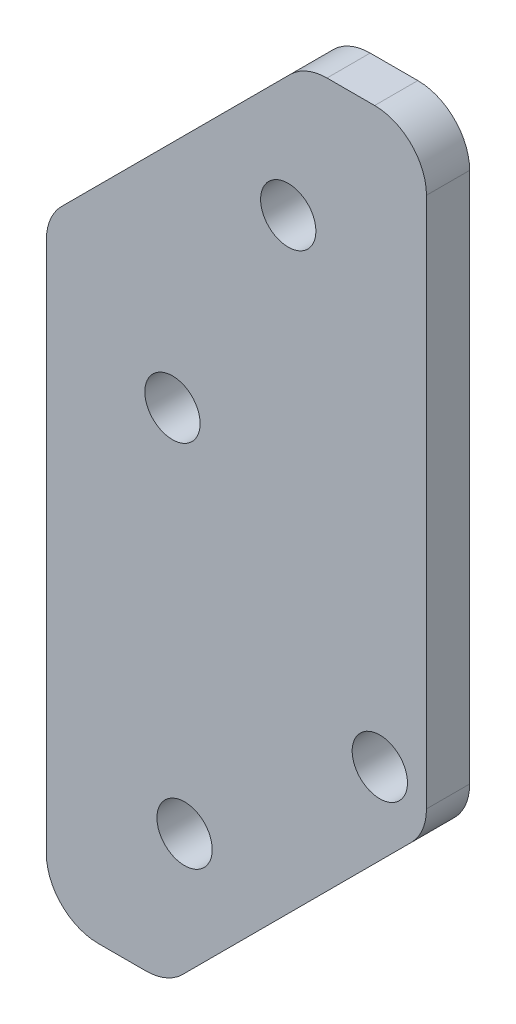
ISO-10303-21;
HEADER;
FILE_DESCRIPTION(('STEP AP214'),'2;1');
FILE_NAME('part.step','',(''),(''),'','','');
FILE_SCHEMA(('AUTOMOTIVE_DESIGN { 1 0 10303 214 1 1 1 1 }'));
ENDSEC;
DATA;
#1=APPLICATION_CONTEXT('core data for automotive mechanical design processes');
#2=APPLICATION_PROTOCOL_DEFINITION('international standard','automotive_design',2000,#1);
#3=PRODUCT_CONTEXT('',#1,'mechanical');
#4=PRODUCT('Part','Part','',(#3));
#5=PRODUCT_RELATED_PRODUCT_CATEGORY('part','',(#4));
#6=PRODUCT_DEFINITION_FORMATION('','',#4);
#7=PRODUCT_DEFINITION_CONTEXT('part definition',#1,'design');
#8=PRODUCT_DEFINITION('design','',#6,#7);
#9=PRODUCT_DEFINITION_SHAPE('','',#8);
#10=(LENGTH_UNIT() NAMED_UNIT(*) SI_UNIT(.MILLI.,.METRE.));
#11=(NAMED_UNIT(*) PLANE_ANGLE_UNIT() SI_UNIT($,.RADIAN.));
#12=(NAMED_UNIT(*) SI_UNIT($,.STERADIAN.) SOLID_ANGLE_UNIT());
#13=UNCERTAINTY_MEASURE_WITH_UNIT(LENGTH_MEASURE(1.E-05),#10,'distance_accuracy_value','');
#14=(GEOMETRIC_REPRESENTATION_CONTEXT(3) GLOBAL_UNCERTAINTY_ASSIGNED_CONTEXT((#13)) GLOBAL_UNIT_ASSIGNED_CONTEXT((#10,
#11,#12)) REPRESENTATION_CONTEXT('',''));
#15=CARTESIAN_POINT('',(0.,0.,0.));
#16=DIRECTION('',(0.,0.,1.));
#17=DIRECTION('',(1.,0.,0.));
#18=AXIS2_PLACEMENT_3D('',#15,#16,#17);
#19=CARTESIAN_POINT('',(0.,0.,2.5));
#20=DIRECTION('',(0.,0.,-1.));
#21=DIRECTION('',(-1.,0.,0.));
#22=AXIS2_PLACEMENT_3D('',#19,#20,#21);
#23=PLANE('',#22);
#24=DIRECTION('',(0.,1.,0.));
#25=VECTOR('',#24,1.);
#26=CARTESIAN_POINT('',(11.,25.,2.5));
#27=LINE('',#26,#25);
#28=CARTESIAN_POINT('',(11.,-8.75735931288073,2.5));
#29=VERTEX_POINT('',#28);
#30=CARTESIAN_POINT('',(11.,22.,2.5));
#31=VERTEX_POINT('',#30);
#32=EDGE_CURVE('E166',#29,#31,#27,.T.);
#33=ORIENTED_EDGE('',*,*,#32,.T.);
#34=CARTESIAN_POINT('',(8.,22.,2.5));
#35=DIRECTION('',(0.,0.,-1.));
#36=DIRECTION('',(-1.,0.,0.));
#37=AXIS2_PLACEMENT_3D('',#34,#35,#36);
#38=CIRCLE('',#37,3.);
#39=CARTESIAN_POINT('',(8.,25.,2.5));
#40=VERTEX_POINT('',#39);
#41=EDGE_CURVE('E203',#31,#40,#38,.F.);
#42=ORIENTED_EDGE('',*,*,#41,.T.);
#43=DIRECTION('',(-1.,0.,0.));
#44=VECTOR('',#43,1.);
#45=CARTESIAN_POINT('',(-11.,25.,2.5));
#46=LINE('',#45,#44);
#47=CARTESIAN_POINT('',(5.24264068711932,25.,2.5));
#48=VERTEX_POINT('',#47);
#49=EDGE_CURVE('E147',#40,#48,#46,.T.);
#50=ORIENTED_EDGE('',*,*,#49,.T.);
#51=CARTESIAN_POINT('',(5.24264068711932,22.,2.5));
#52=DIRECTION('',(0.,0.,-1.));
#53=DIRECTION('',(-1.,0.,0.));
#54=AXIS2_PLACEMENT_3D('',#51,#52,#53);
#55=CIRCLE('',#54,3.);
#56=CARTESIAN_POINT('',(3.12132034355968,24.1213203435596,2.5));
#57=VERTEX_POINT('',#56);
#58=EDGE_CURVE('E196',#48,#57,#55,.F.);
#59=ORIENTED_EDGE('',*,*,#58,.T.);
#60=DIRECTION('',(0.707106781186549,0.707106781186546,0.));
#61=VECTOR('',#60,1.);
#62=CARTESIAN_POINT('',(-11.,10.,2.5));
#63=LINE('',#62,#61);
#64=CARTESIAN_POINT('',(-10.1213203435596,10.8786796564404,2.5));
#65=VERTEX_POINT('',#64);
#66=EDGE_CURVE('E180',#57,#65,#63,.F.);
#67=ORIENTED_EDGE('',*,*,#66,.T.);
#68=CARTESIAN_POINT('',(-8.,8.75735931288072,2.5));
#69=DIRECTION('',(0.,0.,-1.));
#70=DIRECTION('',(-1.,0.,0.));
#71=AXIS2_PLACEMENT_3D('',#68,#69,#70);
#72=CIRCLE('',#71,3.);
#73=CARTESIAN_POINT('',(-11.,8.75735931288072,2.5));
#74=VERTEX_POINT('',#73);
#75=EDGE_CURVE('E198',#65,#74,#72,.F.);
#76=ORIENTED_EDGE('',*,*,#75,.T.);
#77=DIRECTION('',(0.,-1.,0.));
#78=VECTOR('',#77,1.);
#79=CARTESIAN_POINT('',(-11.,25.,2.5));
#80=LINE('',#79,#78);
#81=CARTESIAN_POINT('',(-11.,-22.,2.5));
#82=VERTEX_POINT('',#81);
#83=EDGE_CURVE('E229',#74,#82,#80,.T.);
#84=ORIENTED_EDGE('',*,*,#83,.T.);
#85=CARTESIAN_POINT('',(-8.,-22.,2.5));
#86=DIRECTION('',(0.,0.,-1.));
#87=DIRECTION('',(-1.,0.,0.));
#88=AXIS2_PLACEMENT_3D('',#85,#86,#87);
#89=CIRCLE('',#88,3.);
#90=CARTESIAN_POINT('',(-8.,-25.,2.5));
#91=VERTEX_POINT('',#90);
#92=EDGE_CURVE('E194',#82,#91,#89,.F.);
#93=ORIENTED_EDGE('',*,*,#92,.T.);
#94=DIRECTION('',(1.,0.,0.));
#95=VECTOR('',#94,1.);
#96=CARTESIAN_POINT('',(-11.,-25.,2.5));
#97=LINE('',#96,#95);
#98=CARTESIAN_POINT('',(-5.24264068711933,-25.,2.5));
#99=VERTEX_POINT('',#98);
#100=EDGE_CURVE('E232',#91,#99,#97,.T.);
#101=ORIENTED_EDGE('',*,*,#100,.T.);
#102=CARTESIAN_POINT('',(-5.24264068711933,-22.,2.5));
#103=DIRECTION('',(0.,0.,-1.));
#104=DIRECTION('',(-1.,0.,0.));
#105=AXIS2_PLACEMENT_3D('',#102,#103,#104);
#106=CIRCLE('',#105,3.);
#107=CARTESIAN_POINT('',(-3.12132034355969,-24.1213203435597,2.5));
#108=VERTEX_POINT('',#107);
#109=EDGE_CURVE('E59',#99,#108,#106,.F.);
#110=ORIENTED_EDGE('',*,*,#109,.T.);
#111=DIRECTION('',(-0.707106781186549,-0.707106781186546,0.));
#112=VECTOR('',#111,1.);
#113=CARTESIAN_POINT('',(11.,-10.,2.5));
#114=LINE('',#113,#112);
#115=CARTESIAN_POINT('',(10.1213203435596,-10.8786796564404,2.5));
#116=VERTEX_POINT('',#115);
#117=EDGE_CURVE('E178',#108,#116,#114,.F.);
#118=ORIENTED_EDGE('',*,*,#117,.T.);
#119=CARTESIAN_POINT('',(8.,-8.75735931288073,2.5));
#120=DIRECTION('',(0.,0.,-1.));
#121=DIRECTION('',(-1.,0.,0.));
#122=AXIS2_PLACEMENT_3D('',#119,#120,#121);
#123=CIRCLE('',#122,3.);
#124=EDGE_CURVE('E201',#116,#29,#123,.F.);
#125=ORIENTED_EDGE('',*,*,#124,.T.);
#126=EDGE_LOOP('',(#33,#42,#50,#59,#67,#76,#84,#93,#101,#110,#118,#125));
#127=FACE_BOUND('',#126,.T.);
#128=CARTESIAN_POINT('',(-3.,-17.,2.5));
#129=DIRECTION('',(0.,0.,1.));
#130=DIRECTION('',(1.,0.,0.));
#131=AXIS2_PLACEMENT_3D('',#128,#129,#130);
#132=CIRCLE('',#131,1.6);
#133=CARTESIAN_POINT('',(-1.4,-17.,2.5));
#134=VERTEX_POINT('',#133);
#135=EDGE_CURVE('E157',#134,#134,#132,.T.);
#136=ORIENTED_EDGE('',*,*,#135,.F.);
#137=EDGE_LOOP('',(#136));
#138=FACE_BOUND('',#137,.T.);
#139=CARTESIAN_POINT('',(3.,17.,2.5));
#140=DIRECTION('',(0.,0.,1.));
#141=DIRECTION('',(1.,0.,0.));
#142=AXIS2_PLACEMENT_3D('',#139,#140,#141);
#143=CIRCLE('',#142,1.6);
#144=CARTESIAN_POINT('',(4.6,17.,2.5));
#145=VERTEX_POINT('',#144);
#146=EDGE_CURVE('E425',#145,#145,#143,.T.);
#147=ORIENTED_EDGE('',*,*,#146,.F.);
#148=EDGE_LOOP('',(#147));
#149=FACE_BOUND('',#148,.T.);
#150=CARTESIAN_POINT('',(-3.70000000000153,3.99999999997326,2.5));
#151=DIRECTION('',(0.,0.,1.));
#152=DIRECTION('',(1.,0.,0.));
#153=AXIS2_PLACEMENT_3D('',#150,#151,#152);
#154=CIRCLE('',#153,1.6);
#155=CARTESIAN_POINT('',(-2.10000000000153,3.99999999997326,2.5));
#156=VERTEX_POINT('',#155);
#157=EDGE_CURVE('E431',#156,#156,#154,.T.);
#158=ORIENTED_EDGE('',*,*,#157,.F.);
#159=EDGE_LOOP('',(#158));
#160=FACE_BOUND('',#159,.T.);
#161=CARTESIAN_POINT('',(8.29999999999847,-8.00000000002674,2.5));
#162=DIRECTION('',(0.,0.,1.));
#163=DIRECTION('',(1.,0.,0.));
#164=AXIS2_PLACEMENT_3D('',#161,#162,#163);
#165=CIRCLE('',#164,1.6);
#166=CARTESIAN_POINT('',(9.89999999999848,-8.00000000002674,2.5));
#167=VERTEX_POINT('',#166);
#168=EDGE_CURVE('E437',#167,#167,#165,.T.);
#169=ORIENTED_EDGE('',*,*,#168,.F.);
#170=EDGE_LOOP('',(#169));
#171=FACE_BOUND('',#170,.T.);
#172=ADVANCED_FACE('F37',(#127,#138,#149,#160,#171),#23,.F.);
#173=CARTESIAN_POINT('',(0.,0.,0.));
#174=DIRECTION('',(0.,0.,-1.));
#175=DIRECTION('',(-1.,0.,0.));
#176=AXIS2_PLACEMENT_3D('',#173,#174,#175);
#177=PLANE('',#176);
#178=CARTESIAN_POINT('',(-3.70000000000153,3.99999999997326,0.));
#179=DIRECTION('',(0.,0.,1.));
#180=DIRECTION('',(1.,0.,0.));
#181=AXIS2_PLACEMENT_3D('',#178,#179,#180);
#182=CIRCLE('',#181,1.6);
#183=CARTESIAN_POINT('',(-2.10000000000153,3.99999999997326,0.));
#184=VERTEX_POINT('',#183);
#185=EDGE_CURVE('E434',#184,#184,#182,.T.);
#186=ORIENTED_EDGE('',*,*,#185,.T.);
#187=EDGE_LOOP('',(#186));
#188=FACE_BOUND('',#187,.T.);
#189=CARTESIAN_POINT('',(-3.,-17.,0.));
#190=DIRECTION('',(0.,0.,1.));
#191=DIRECTION('',(1.,0.,0.));
#192=AXIS2_PLACEMENT_3D('',#189,#190,#191);
#193=CIRCLE('',#192,1.6);
#194=CARTESIAN_POINT('',(-1.4,-17.,0.));
#195=VERTEX_POINT('',#194);
#196=EDGE_CURVE('E163',#195,#195,#193,.T.);
#197=ORIENTED_EDGE('',*,*,#196,.T.);
#198=EDGE_LOOP('',(#197));
#199=FACE_BOUND('',#198,.T.);
#200=DIRECTION('',(-1.,0.,0.));
#201=VECTOR('',#200,1.);
#202=CARTESIAN_POINT('',(-11.,25.,0.));
#203=LINE('',#202,#201);
#204=CARTESIAN_POINT('',(8.,25.,0.));
#205=VERTEX_POINT('',#204);
#206=CARTESIAN_POINT('',(5.24264068711932,25.,0.));
#207=VERTEX_POINT('',#206);
#208=EDGE_CURVE('E144',#205,#207,#203,.T.);
#209=ORIENTED_EDGE('',*,*,#208,.F.);
#210=CARTESIAN_POINT('',(8.,22.,0.));
#211=DIRECTION('',(0.,0.,-1.));
#212=DIRECTION('',(-1.,0.,0.));
#213=AXIS2_PLACEMENT_3D('',#210,#211,#212);
#214=CIRCLE('',#213,3.);
#215=CARTESIAN_POINT('',(11.,22.,0.));
#216=VERTEX_POINT('',#215);
#217=EDGE_CURVE('E126',#205,#216,#214,.T.);
#218=ORIENTED_EDGE('',*,*,#217,.T.);
#219=DIRECTION('',(0.,1.,0.));
#220=VECTOR('',#219,1.);
#221=CARTESIAN_POINT('',(11.,25.,0.));
#222=LINE('',#221,#220);
#223=CARTESIAN_POINT('',(11.,-8.75735931288073,0.));
#224=VERTEX_POINT('',#223);
#225=EDGE_CURVE('E171',#224,#216,#222,.T.);
#226=ORIENTED_EDGE('',*,*,#225,.F.);
#227=CARTESIAN_POINT('',(8.,-8.75735931288073,0.));
#228=DIRECTION('',(0.,0.,-1.));
#229=DIRECTION('',(-1.,0.,0.));
#230=AXIS2_PLACEMENT_3D('',#227,#228,#229);
#231=CIRCLE('',#230,3.);
#232=CARTESIAN_POINT('',(10.1213203435596,-10.8786796564404,0.));
#233=VERTEX_POINT('',#232);
#234=EDGE_CURVE('E137',#224,#233,#231,.T.);
#235=ORIENTED_EDGE('',*,*,#234,.T.);
#236=DIRECTION('',(0.707106781186549,0.707106781186546,0.));
#237=VECTOR('',#236,1.);
#238=CARTESIAN_POINT('',(10.5,-10.5,0.));
#239=LINE('',#238,#237);
#240=CARTESIAN_POINT('',(-3.12132034355969,-24.1213203435597,0.));
#241=VERTEX_POINT('',#240);
#242=EDGE_CURVE('E173',#233,#241,#239,.F.);
#243=ORIENTED_EDGE('',*,*,#242,.T.);
#244=CARTESIAN_POINT('',(-5.24264068711933,-22.,0.));
#245=DIRECTION('',(0.,0.,-1.));
#246=DIRECTION('',(-1.,0.,0.));
#247=AXIS2_PLACEMENT_3D('',#244,#245,#246);
#248=CIRCLE('',#247,3.);
#249=CARTESIAN_POINT('',(-5.24264068711933,-25.,0.));
#250=VERTEX_POINT('',#249);
#251=EDGE_CURVE('E188',#241,#250,#248,.T.);
#252=ORIENTED_EDGE('',*,*,#251,.T.);
#253=DIRECTION('',(1.,0.,0.));
#254=VECTOR('',#253,1.);
#255=CARTESIAN_POINT('',(-11.,-25.,0.));
#256=LINE('',#255,#254);
#257=CARTESIAN_POINT('',(-8.,-25.,0.));
#258=VERTEX_POINT('',#257);
#259=EDGE_CURVE('E160',#258,#250,#256,.T.);
#260=ORIENTED_EDGE('',*,*,#259,.F.);
#261=CARTESIAN_POINT('',(-8.,-22.,0.));
#262=DIRECTION('',(0.,0.,-1.));
#263=DIRECTION('',(-1.,0.,0.));
#264=AXIS2_PLACEMENT_3D('',#261,#262,#263);
#265=CIRCLE('',#264,3.);
#266=CARTESIAN_POINT('',(-11.,-22.,0.));
#267=VERTEX_POINT('',#266);
#268=EDGE_CURVE('E148',#258,#267,#265,.T.);
#269=ORIENTED_EDGE('',*,*,#268,.T.);
#270=DIRECTION('',(0.,-1.,0.));
#271=VECTOR('',#270,1.);
#272=CARTESIAN_POINT('',(-11.,25.,0.));
#273=LINE('',#272,#271);
#274=CARTESIAN_POINT('',(-11.,8.75735931288072,0.));
#275=VERTEX_POINT('',#274);
#276=EDGE_CURVE('E156',#275,#267,#273,.T.);
#277=ORIENTED_EDGE('',*,*,#276,.F.);
#278=CARTESIAN_POINT('',(-8.,8.75735931288072,0.));
#279=DIRECTION('',(0.,0.,-1.));
#280=DIRECTION('',(-1.,0.,0.));
#281=AXIS2_PLACEMENT_3D('',#278,#279,#280);
#282=CIRCLE('',#281,3.);
#283=CARTESIAN_POINT('',(-10.1213203435596,10.8786796564404,0.));
#284=VERTEX_POINT('',#283);
#285=EDGE_CURVE('E186',#275,#284,#282,.T.);
#286=ORIENTED_EDGE('',*,*,#285,.T.);
#287=DIRECTION('',(-0.707106781186549,-0.707106781186546,0.));
#288=VECTOR('',#287,1.);
#289=CARTESIAN_POINT('',(-10.5,10.5,0.));
#290=LINE('',#289,#288);
#291=CARTESIAN_POINT('',(3.12132034355969,24.1213203435596,0.));
#292=VERTEX_POINT('',#291);
#293=EDGE_CURVE('E176',#284,#292,#290,.F.);
#294=ORIENTED_EDGE('',*,*,#293,.T.);
#295=CARTESIAN_POINT('',(5.24264068711932,22.,0.));
#296=DIRECTION('',(0.,0.,-1.));
#297=DIRECTION('',(-1.,0.,0.));
#298=AXIS2_PLACEMENT_3D('',#295,#296,#297);
#299=CIRCLE('',#298,3.);
#300=EDGE_CURVE('E155',#292,#207,#299,.T.);
#301=ORIENTED_EDGE('',*,*,#300,.T.);
#302=EDGE_LOOP('',(#209,#218,#226,#235,#243,#252,#260,#269,#277,#286,#294,#301));
#303=FACE_BOUND('',#302,.T.);
#304=CARTESIAN_POINT('',(3.,17.,0.));
#305=DIRECTION('',(0.,0.,1.));
#306=DIRECTION('',(1.,0.,0.));
#307=AXIS2_PLACEMENT_3D('',#304,#305,#306);
#308=CIRCLE('',#307,1.6);
#309=CARTESIAN_POINT('',(4.6,17.,0.));
#310=VERTEX_POINT('',#309);
#311=EDGE_CURVE('E427',#310,#310,#308,.T.);
#312=ORIENTED_EDGE('',*,*,#311,.T.);
#313=EDGE_LOOP('',(#312));
#314=FACE_BOUND('',#313,.T.);
#315=CARTESIAN_POINT('',(8.29999999999847,-8.00000000002674,0.));
#316=DIRECTION('',(0.,0.,1.));
#317=DIRECTION('',(1.,0.,0.));
#318=AXIS2_PLACEMENT_3D('',#315,#316,#317);
#319=CIRCLE('',#318,1.6);
#320=CARTESIAN_POINT('',(9.89999999999848,-8.00000000002674,0.));
#321=VERTEX_POINT('',#320);
#322=EDGE_CURVE('E440',#321,#321,#319,.T.);
#323=ORIENTED_EDGE('',*,*,#322,.T.);
#324=EDGE_LOOP('',(#323));
#325=FACE_BOUND('',#324,.T.);
#326=ADVANCED_FACE('F151',(#188,#199,#303,#314,#325),#177,.T.);
#327=CARTESIAN_POINT('',(-11.,25.,2.5));
#328=DIRECTION('',(0.,-1.,0.));
#329=DIRECTION('',(0.,0.,-1.));
#330=AXIS2_PLACEMENT_3D('',#327,#328,#329);
#331=PLANE('',#330);
#332=ORIENTED_EDGE('',*,*,#49,.F.);
#333=DIRECTION('',(0.,0.,-1.));
#334=VECTOR('',#333,1.);
#335=CARTESIAN_POINT('',(8.,25.,2.5));
#336=LINE('',#335,#334);
#337=EDGE_CURVE('E130',#40,#205,#336,.T.);
#338=ORIENTED_EDGE('',*,*,#337,.T.);
#339=ORIENTED_EDGE('',*,*,#208,.T.);
#340=DIRECTION('',(0.,0.,-1.));
#341=VECTOR('',#340,1.);
#342=CARTESIAN_POINT('',(5.24264068711932,25.,2.5));
#343=LINE('',#342,#341);
#344=EDGE_CURVE('E149',#207,#48,#343,.F.);
#345=ORIENTED_EDGE('',*,*,#344,.T.);
#346=EDGE_LOOP('',(#332,#338,#339,#345));
#347=FACE_BOUND('',#346,.T.);
#348=ADVANCED_FACE('F142',(#347),#331,.F.);
#349=CARTESIAN_POINT('',(-11.,25.,2.5));
#350=DIRECTION('',(1.,0.,0.));
#351=DIRECTION('',(0.,1.,0.));
#352=AXIS2_PLACEMENT_3D('',#349,#350,#351);
#353=PLANE('',#352);
#354=ORIENTED_EDGE('',*,*,#83,.F.);
#355=DIRECTION('',(0.,0.,1.));
#356=VECTOR('',#355,1.);
#357=CARTESIAN_POINT('',(-11.,8.75735931288072,0.));
#358=LINE('',#357,#356);
#359=EDGE_CURVE('E216',#74,#275,#358,.F.);
#360=ORIENTED_EDGE('',*,*,#359,.T.);
#361=ORIENTED_EDGE('',*,*,#276,.T.);
#362=DIRECTION('',(0.,0.,-1.));
#363=VECTOR('',#362,1.);
#364=CARTESIAN_POINT('',(-11.,-22.,2.5));
#365=LINE('',#364,#363);
#366=EDGE_CURVE('E214',#267,#82,#365,.F.);
#367=ORIENTED_EDGE('',*,*,#366,.T.);
#368=EDGE_LOOP('',(#354,#360,#361,#367));
#369=FACE_BOUND('',#368,.T.);
#370=ADVANCED_FACE('F258',(#369),#353,.F.);
#371=CARTESIAN_POINT('',(-11.,-25.,2.5));
#372=DIRECTION('',(0.,1.,0.));
#373=DIRECTION('',(-1.,0.,0.));
#374=AXIS2_PLACEMENT_3D('',#371,#372,#373);
#375=PLANE('',#374);
#376=ORIENTED_EDGE('',*,*,#259,.T.);
#377=DIRECTION('',(0.,0.,-1.));
#378=VECTOR('',#377,1.);
#379=CARTESIAN_POINT('',(-5.24264068711933,-25.,2.5));
#380=LINE('',#379,#378);
#381=EDGE_CURVE('E211',#250,#99,#380,.F.);
#382=ORIENTED_EDGE('',*,*,#381,.T.);
#383=ORIENTED_EDGE('',*,*,#100,.F.);
#384=DIRECTION('',(0.,0.,-1.));
#385=VECTOR('',#384,1.);
#386=CARTESIAN_POINT('',(-8.,-25.,2.5));
#387=LINE('',#386,#385);
#388=EDGE_CURVE('E208',#91,#258,#387,.T.);
#389=ORIENTED_EDGE('',*,*,#388,.T.);
#390=EDGE_LOOP('',(#376,#382,#383,#389));
#391=FACE_BOUND('',#390,.T.);
#392=ADVANCED_FACE('F251',(#391),#375,.F.);
#393=CARTESIAN_POINT('',(11.,25.,2.5));
#394=DIRECTION('',(-1.,0.,0.));
#395=DIRECTION('',(0.,-1.,0.));
#396=AXIS2_PLACEMENT_3D('',#393,#394,#395);
#397=PLANE('',#396);
#398=ORIENTED_EDGE('',*,*,#225,.T.);
#399=DIRECTION('',(0.,0.,-1.));
#400=VECTOR('',#399,1.);
#401=CARTESIAN_POINT('',(11.,22.,2.5));
#402=LINE('',#401,#400);
#403=EDGE_CURVE('E131',#216,#31,#402,.F.);
#404=ORIENTED_EDGE('',*,*,#403,.T.);
#405=ORIENTED_EDGE('',*,*,#32,.F.);
#406=DIRECTION('',(0.,0.,1.));
#407=VECTOR('',#406,1.);
#408=CARTESIAN_POINT('',(11.,-8.75735931288073,0.));
#409=LINE('',#408,#407);
#410=EDGE_CURVE('E136',#29,#224,#409,.F.);
#411=ORIENTED_EDGE('',*,*,#410,.T.);
#412=EDGE_LOOP('',(#398,#404,#405,#411));
#413=FACE_BOUND('',#412,.T.);
#414=ADVANCED_FACE('F240',(#413),#397,.F.);
#415=CARTESIAN_POINT('',(-3.,-17.,2.5));
#416=DIRECTION('',(0.,0.,-1.));
#417=DIRECTION('',(-1.,0.,0.));
#418=AXIS2_PLACEMENT_3D('',#415,#416,#417);
#419=CYLINDRICAL_SURFACE('',#418,1.6);
#420=ORIENTED_EDGE('',*,*,#135,.T.);
#421=EDGE_LOOP('',(#420));
#422=FACE_BOUND('',#421,.T.);
#423=ORIENTED_EDGE('',*,*,#196,.F.);
#424=EDGE_LOOP('',(#423));
#425=FACE_BOUND('',#424,.T.);
#426=ADVANCED_FACE('F278',(#422,#425),#419,.F.);
#427=CARTESIAN_POINT('',(3.,17.,2.5));
#428=DIRECTION('',(0.,0.,-1.));
#429=DIRECTION('',(-1.,0.,0.));
#430=AXIS2_PLACEMENT_3D('',#427,#428,#429);
#431=CYLINDRICAL_SURFACE('',#430,1.6);
#432=ORIENTED_EDGE('',*,*,#146,.T.);
#433=EDGE_LOOP('',(#432));
#434=FACE_BOUND('',#433,.T.);
#435=ORIENTED_EDGE('',*,*,#311,.F.);
#436=EDGE_LOOP('',(#435));
#437=FACE_BOUND('',#436,.T.);
#438=ADVANCED_FACE('F364',(#434,#437),#431,.F.);
#439=CARTESIAN_POINT('',(-3.70000000000153,3.99999999997326,2.5));
#440=DIRECTION('',(0.,0.,-1.));
#441=DIRECTION('',(-1.,0.,0.));
#442=AXIS2_PLACEMENT_3D('',#439,#440,#441);
#443=CYLINDRICAL_SURFACE('',#442,1.6);
#444=ORIENTED_EDGE('',*,*,#157,.T.);
#445=EDGE_LOOP('',(#444));
#446=FACE_BOUND('',#445,.T.);
#447=ORIENTED_EDGE('',*,*,#185,.F.);
#448=EDGE_LOOP('',(#447));
#449=FACE_BOUND('',#448,.T.);
#450=ADVANCED_FACE('F355',(#446,#449),#443,.F.);
#451=CARTESIAN_POINT('',(8.29999999999847,-8.00000000002674,2.5));
#452=DIRECTION('',(0.,0.,-1.));
#453=DIRECTION('',(-1.,0.,0.));
#454=AXIS2_PLACEMENT_3D('',#451,#452,#453);
#455=CYLINDRICAL_SURFACE('',#454,1.6);
#456=ORIENTED_EDGE('',*,*,#168,.T.);
#457=EDGE_LOOP('',(#456));
#458=FACE_BOUND('',#457,.T.);
#459=ORIENTED_EDGE('',*,*,#322,.F.);
#460=EDGE_LOOP('',(#459));
#461=FACE_BOUND('',#460,.T.);
#462=ADVANCED_FACE('F295',(#458,#461),#455,.F.);
#463=CARTESIAN_POINT('',(-11.,10.,2.5));
#464=DIRECTION('',(0.707106781186546,-0.707106781186549,0.));
#465=DIRECTION('',(0.,0.,-1.));
#466=AXIS2_PLACEMENT_3D('',#463,#464,#465);
#467=PLANE('',#466);
#468=ORIENTED_EDGE('',*,*,#293,.F.);
#469=DIRECTION('',(0.,0.,-1.));
#470=VECTOR('',#469,1.);
#471=CARTESIAN_POINT('',(-10.1213203435596,10.8786796564404,2.5));
#472=LINE('',#471,#470);
#473=EDGE_CURVE('E11',#284,#65,#472,.F.);
#474=ORIENTED_EDGE('',*,*,#473,.T.);
#475=ORIENTED_EDGE('',*,*,#66,.F.);
#476=DIRECTION('',(0.,0.,1.));
#477=VECTOR('',#476,1.);
#478=CARTESIAN_POINT('',(3.12132034355969,24.1213203435596,0.));
#479=LINE('',#478,#477);
#480=EDGE_CURVE('E45',#57,#292,#479,.F.);
#481=ORIENTED_EDGE('',*,*,#480,.T.);
#482=EDGE_LOOP('',(#468,#474,#475,#481));
#483=FACE_BOUND('',#482,.T.);
#484=ADVANCED_FACE('F222',(#483),#467,.F.);
#485=CARTESIAN_POINT('',(11.,-10.,2.5));
#486=DIRECTION('',(-0.707106781186546,0.707106781186549,0.));
#487=DIRECTION('',(0.,0.,-1.));
#488=AXIS2_PLACEMENT_3D('',#485,#486,#487);
#489=PLANE('',#488);
#490=ORIENTED_EDGE('',*,*,#242,.F.);
#491=DIRECTION('',(0.,0.,-1.));
#492=VECTOR('',#491,1.);
#493=CARTESIAN_POINT('',(10.1213203435596,-10.8786796564404,2.5));
#494=LINE('',#493,#492);
#495=EDGE_CURVE('E52',#233,#116,#494,.F.);
#496=ORIENTED_EDGE('',*,*,#495,.T.);
#497=ORIENTED_EDGE('',*,*,#117,.F.);
#498=DIRECTION('',(0.,0.,1.));
#499=VECTOR('',#498,1.);
#500=CARTESIAN_POINT('',(-3.12132034355969,-24.1213203435597,0.));
#501=LINE('',#500,#499);
#502=EDGE_CURVE('E205',#108,#241,#501,.F.);
#503=ORIENTED_EDGE('',*,*,#502,.T.);
#504=EDGE_LOOP('',(#490,#496,#497,#503));
#505=FACE_BOUND('',#504,.T.);
#506=ADVANCED_FACE('F244',(#505),#489,.F.);
#507=CARTESIAN_POINT('',(8.,22.,2.5));
#508=DIRECTION('',(0.,0.,-1.));
#509=DIRECTION('',(-1.,0.,0.));
#510=AXIS2_PLACEMENT_3D('',#507,#508,#509);
#511=CYLINDRICAL_SURFACE('',#510,3.);
#512=ORIENTED_EDGE('',*,*,#41,.F.);
#513=ORIENTED_EDGE('',*,*,#403,.F.);
#514=ORIENTED_EDGE('',*,*,#217,.F.);
#515=ORIENTED_EDGE('',*,*,#337,.F.);
#516=EDGE_LOOP('',(#512,#513,#514,#515));
#517=FACE_BOUND('',#516,.T.);
#518=ADVANCED_FACE('F129',(#517),#511,.T.);
#519=CARTESIAN_POINT('',(8.,-8.75735931288073,2.5));
#520=DIRECTION('',(0.,0.,-1.));
#521=DIRECTION('',(-1.,0.,0.));
#522=AXIS2_PLACEMENT_3D('',#519,#520,#521);
#523=CYLINDRICAL_SURFACE('',#522,3.);
#524=ORIENTED_EDGE('',*,*,#124,.F.);
#525=ORIENTED_EDGE('',*,*,#495,.F.);
#526=ORIENTED_EDGE('',*,*,#234,.F.);
#527=ORIENTED_EDGE('',*,*,#410,.F.);
#528=EDGE_LOOP('',(#524,#525,#526,#527));
#529=FACE_BOUND('',#528,.T.);
#530=ADVANCED_FACE('F242',(#529),#523,.T.);
#531=CARTESIAN_POINT('',(-5.24264068711933,-22.,2.5));
#532=DIRECTION('',(0.,0.,1.));
#533=DIRECTION('',(1.,0.,0.));
#534=AXIS2_PLACEMENT_3D('',#531,#532,#533);
#535=CYLINDRICAL_SURFACE('',#534,3.);
#536=ORIENTED_EDGE('',*,*,#251,.F.);
#537=ORIENTED_EDGE('',*,*,#502,.F.);
#538=ORIENTED_EDGE('',*,*,#109,.F.);
#539=ORIENTED_EDGE('',*,*,#381,.F.);
#540=EDGE_LOOP('',(#536,#537,#538,#539));
#541=FACE_BOUND('',#540,.T.);
#542=ADVANCED_FACE('F247',(#541),#535,.T.);
#543=CARTESIAN_POINT('',(-8.,8.75735931288072,2.5));
#544=DIRECTION('',(0.,0.,-1.));
#545=DIRECTION('',(-1.,0.,0.));
#546=AXIS2_PLACEMENT_3D('',#543,#544,#545);
#547=CYLINDRICAL_SURFACE('',#546,3.);
#548=ORIENTED_EDGE('',*,*,#75,.F.);
#549=ORIENTED_EDGE('',*,*,#473,.F.);
#550=ORIENTED_EDGE('',*,*,#285,.F.);
#551=ORIENTED_EDGE('',*,*,#359,.F.);
#552=EDGE_LOOP('',(#548,#549,#550,#551));
#553=FACE_BOUND('',#552,.T.);
#554=ADVANCED_FACE('F262',(#553),#547,.T.);
#555=CARTESIAN_POINT('',(5.24264068711932,22.,2.5));
#556=DIRECTION('',(0.,0.,1.));
#557=DIRECTION('',(1.,0.,0.));
#558=AXIS2_PLACEMENT_3D('',#555,#556,#557);
#559=CYLINDRICAL_SURFACE('',#558,3.);
#560=ORIENTED_EDGE('',*,*,#300,.F.);
#561=ORIENTED_EDGE('',*,*,#480,.F.);
#562=ORIENTED_EDGE('',*,*,#58,.F.);
#563=ORIENTED_EDGE('',*,*,#344,.F.);
#564=EDGE_LOOP('',(#560,#561,#562,#563));
#565=FACE_BOUND('',#564,.T.);
#566=ADVANCED_FACE('F226',(#565),#559,.T.);
#567=CARTESIAN_POINT('',(-8.,-22.,2.5));
#568=DIRECTION('',(0.,0.,-1.));
#569=DIRECTION('',(-1.,0.,0.));
#570=AXIS2_PLACEMENT_3D('',#567,#568,#569);
#571=CYLINDRICAL_SURFACE('',#570,3.);
#572=ORIENTED_EDGE('',*,*,#92,.F.);
#573=ORIENTED_EDGE('',*,*,#366,.F.);
#574=ORIENTED_EDGE('',*,*,#268,.F.);
#575=ORIENTED_EDGE('',*,*,#388,.F.);
#576=EDGE_LOOP('',(#572,#573,#574,#575));
#577=FACE_BOUND('',#576,.T.);
#578=ADVANCED_FACE('F39',(#577),#571,.T.);
#579=CLOSED_SHELL('',(#172,#326,#348,#370,#392,#414,#426,#438,#450,#462,#484,#506,#518,#530,
#542,#554,#566,#578));
#580=MANIFOLD_SOLID_BREP('B2',#579);
#581=ADVANCED_BREP_SHAPE_REPRESENTATION('',(#18,#580),#14);
#582=SHAPE_DEFINITION_REPRESENTATION(#9,#581);
ENDSEC;
END-ISO-10303-21;
